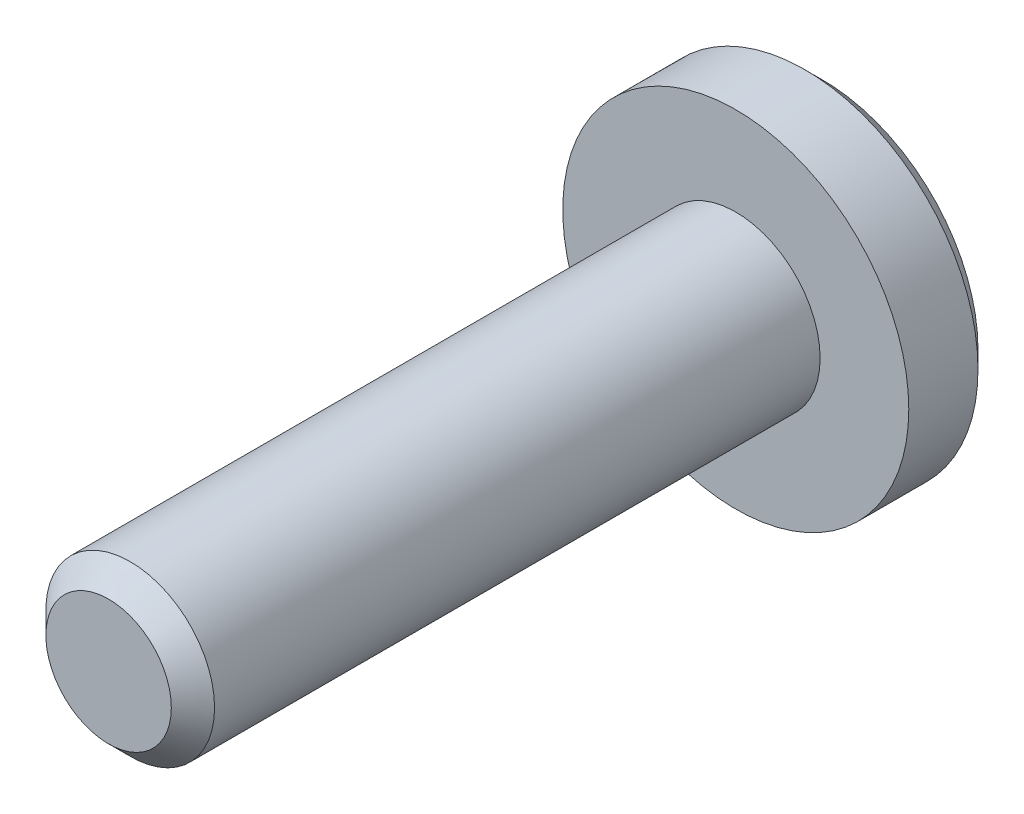
ISO-10303-21;
HEADER;
FILE_DESCRIPTION(('STEP AP214'),'2;1');
FILE_NAME('part.step','',(''),(''),'','','');
FILE_SCHEMA(('AUTOMOTIVE_DESIGN { 1 0 10303 214 1 1 1 1 }'));
ENDSEC;
DATA;
#1=APPLICATION_CONTEXT('core data for automotive mechanical design processes');
#2=APPLICATION_PROTOCOL_DEFINITION('international standard','automotive_design',2000,#1);
#3=PRODUCT_CONTEXT('',#1,'mechanical');
#4=PRODUCT('Part','Part','',(#3));
#5=PRODUCT_RELATED_PRODUCT_CATEGORY('part','',(#4));
#6=PRODUCT_DEFINITION_FORMATION('','',#4);
#7=PRODUCT_DEFINITION_CONTEXT('part definition',#1,'design');
#8=PRODUCT_DEFINITION('design','',#6,#7);
#9=PRODUCT_DEFINITION_SHAPE('','',#8);
#10=(LENGTH_UNIT() NAMED_UNIT(*) SI_UNIT(.MILLI.,.METRE.));
#11=(NAMED_UNIT(*) PLANE_ANGLE_UNIT() SI_UNIT($,.RADIAN.));
#12=(NAMED_UNIT(*) SI_UNIT($,.STERADIAN.) SOLID_ANGLE_UNIT());
#13=UNCERTAINTY_MEASURE_WITH_UNIT(LENGTH_MEASURE(1.E-05),#10,'distance_accuracy_value','');
#14=(GEOMETRIC_REPRESENTATION_CONTEXT(3) GLOBAL_UNCERTAINTY_ASSIGNED_CONTEXT((#13)) GLOBAL_UNIT_ASSIGNED_CONTEXT((#10,
#11,#12)) REPRESENTATION_CONTEXT('',''));
#15=CARTESIAN_POINT('',(0.,0.,0.));
#16=DIRECTION('',(0.,0.,1.));
#17=DIRECTION('',(1.,0.,0.));
#18=AXIS2_PLACEMENT_3D('',#15,#16,#17);
#19=CARTESIAN_POINT('',(0.,0.,16.5));
#20=DIRECTION('',(0.,0.,1.));
#21=DIRECTION('',(1.,0.,0.));
#22=AXIS2_PLACEMENT_3D('',#19,#20,#21);
#23=PLANE('',#22);
#24=CARTESIAN_POINT('',(0.,0.,16.5));
#25=DIRECTION('',(0.,0.,1.));
#26=DIRECTION('',(1.,0.,0.));
#27=AXIS2_PLACEMENT_3D('',#24,#25,#26);
#28=CIRCLE('',#27,1.45);
#29=CARTESIAN_POINT('',(1.45,0.,16.5));
#30=VERTEX_POINT('',#29);
#31=EDGE_CURVE('E10',#30,#30,#28,.T.);
#32=ORIENTED_EDGE('',*,*,#31,.T.);
#33=EDGE_LOOP('',(#32));
#34=FACE_BOUND('',#33,.T.);
#35=ADVANCED_FACE('F15',(#34),#23,.T.);
#36=CARTESIAN_POINT('',(0.,0.,16.));
#37=DIRECTION('',(0.,0.,-1.));
#38=DIRECTION('',(1.,0.,0.));
#39=AXIS2_PLACEMENT_3D('',#36,#37,#38);
#40=CONICAL_SURFACE('',#39,1.95,0.785398163397);
#41=ORIENTED_EDGE('',*,*,#31,.F.);
#42=EDGE_LOOP('',(#41));
#43=FACE_BOUND('',#42,.T.);
#44=CARTESIAN_POINT('',(0.,0.,16.));
#45=DIRECTION('',(0.,0.,1.));
#46=DIRECTION('',(1.,0.,0.));
#47=AXIS2_PLACEMENT_3D('',#44,#45,#46);
#48=CIRCLE('',#47,1.95);
#49=CARTESIAN_POINT('',(1.95,0.,16.));
#50=VERTEX_POINT('',#49);
#51=EDGE_CURVE('E23',#50,#50,#48,.T.);
#52=ORIENTED_EDGE('',*,*,#51,.T.);
#53=EDGE_LOOP('',(#52));
#54=FACE_BOUND('',#53,.T.);
#55=ADVANCED_FACE('F17',(#43,#54),#40,.T.);
#56=CARTESIAN_POINT('',(0.,0.,2.));
#57=DIRECTION('',(0.,0.,1.));
#58=DIRECTION('',(1.,0.,0.));
#59=AXIS2_PLACEMENT_3D('',#56,#57,#58);
#60=CYLINDRICAL_SURFACE('',#59,1.95);
#61=ORIENTED_EDGE('',*,*,#51,.F.);
#62=EDGE_LOOP('',(#61));
#63=FACE_BOUND('',#62,.T.);
#64=CARTESIAN_POINT('',(0.,0.,2.));
#65=DIRECTION('',(0.,0.,1.));
#66=DIRECTION('',(1.,0.,0.));
#67=AXIS2_PLACEMENT_3D('',#64,#65,#66);
#68=CIRCLE('',#67,1.95);
#69=CARTESIAN_POINT('',(1.95,0.,2.));
#70=VERTEX_POINT('',#69);
#71=EDGE_CURVE('E32',#70,#70,#68,.T.);
#72=ORIENTED_EDGE('',*,*,#71,.T.);
#73=EDGE_LOOP('',(#72));
#74=FACE_BOUND('',#73,.T.);
#75=ADVANCED_FACE('F83',(#63,#74),#60,.T.);
#76=CARTESIAN_POINT('',(0.,0.,0.));
#77=DIRECTION('',(0.,0.,1.));
#78=DIRECTION('',(1.,0.,0.));
#79=AXIS2_PLACEMENT_3D('',#76,#77,#78);
#80=PLANE('',#79);
#81=CARTESIAN_POINT('',(0.,0.,0.));
#82=DIRECTION('',(0.,0.,1.));
#83=DIRECTION('',(1.,0.,0.));
#84=AXIS2_PLACEMENT_3D('',#81,#82,#83);
#85=CIRCLE('',#84,3.6);
#86=CARTESIAN_POINT('',(3.6,0.,0.));
#87=VERTEX_POINT('',#86);
#88=EDGE_CURVE('E39',#87,#87,#85,.T.);
#89=ORIENTED_EDGE('',*,*,#88,.F.);
#90=EDGE_LOOP('',(#89));
#91=FACE_BOUND('',#90,.T.);
#92=ADVANCED_FACE('F73',(#91),#80,.F.);
#93=CARTESIAN_POINT('',(0.,0.,2.));
#94=DIRECTION('',(0.,0.,1.));
#95=DIRECTION('',(1.,0.,0.));
#96=AXIS2_PLACEMENT_3D('',#93,#94,#95);
#97=PLANE('',#96);
#98=ORIENTED_EDGE('',*,*,#71,.F.);
#99=EDGE_LOOP('',(#98));
#100=FACE_BOUND('',#99,.T.);
#101=CARTESIAN_POINT('',(0.,0.,2.));
#102=DIRECTION('',(0.,0.,1.));
#103=DIRECTION('',(1.,0.,0.));
#104=AXIS2_PLACEMENT_3D('',#101,#102,#103);
#105=CIRCLE('',#104,4.);
#106=CARTESIAN_POINT('',(4.,0.,2.));
#107=VERTEX_POINT('',#106);
#108=EDGE_CURVE('E49',#107,#107,#105,.T.);
#109=ORIENTED_EDGE('',*,*,#108,.T.);
#110=EDGE_LOOP('',(#109));
#111=FACE_BOUND('',#110,.T.);
#112=ADVANCED_FACE('F56',(#100,#111),#97,.T.);
#113=CARTESIAN_POINT('',(0.,0.,0.4));
#114=DIRECTION('',(0.,0.,1.));
#115=DIRECTION('',(1.,0.,0.));
#116=AXIS2_PLACEMENT_3D('',#113,#114,#115);
#117=CONICAL_SURFACE('',#116,4.,0.785398163397);
#118=ORIENTED_EDGE('',*,*,#88,.T.);
#119=EDGE_LOOP('',(#118));
#120=FACE_BOUND('',#119,.T.);
#121=CARTESIAN_POINT('',(0.,0.,0.4));
#122=DIRECTION('',(0.,0.,1.));
#123=DIRECTION('',(1.,0.,0.));
#124=AXIS2_PLACEMENT_3D('',#121,#122,#123);
#125=CIRCLE('',#124,4.);
#126=CARTESIAN_POINT('',(4.,0.,0.4));
#127=VERTEX_POINT('',#126);
#128=EDGE_CURVE('E45',#127,#127,#125,.T.);
#129=ORIENTED_EDGE('',*,*,#128,.F.);
#130=EDGE_LOOP('',(#129));
#131=FACE_BOUND('',#130,.T.);
#132=ADVANCED_FACE('F61',(#120,#131),#117,.T.);
#133=CARTESIAN_POINT('',(0.,0.,0.));
#134=DIRECTION('',(0.,0.,1.));
#135=DIRECTION('',(1.,0.,0.));
#136=AXIS2_PLACEMENT_3D('',#133,#134,#135);
#137=CYLINDRICAL_SURFACE('',#136,4.);
#138=ORIENTED_EDGE('',*,*,#108,.F.);
#139=EDGE_LOOP('',(#138));
#140=FACE_BOUND('',#139,.T.);
#141=ORIENTED_EDGE('',*,*,#128,.T.);
#142=EDGE_LOOP('',(#141));
#143=FACE_BOUND('',#142,.T.);
#144=ADVANCED_FACE('F58',(#140,#143),#137,.T.);
#145=CLOSED_SHELL('',(#35,#55,#75,#92,#112,#132,#144));
#146=MANIFOLD_SOLID_BREP('B1',#145);
#147=ADVANCED_BREP_SHAPE_REPRESENTATION('',(#18,#146),#14);
#148=SHAPE_DEFINITION_REPRESENTATION(#9,#147);
ENDSEC;
END-ISO-10303-21;
